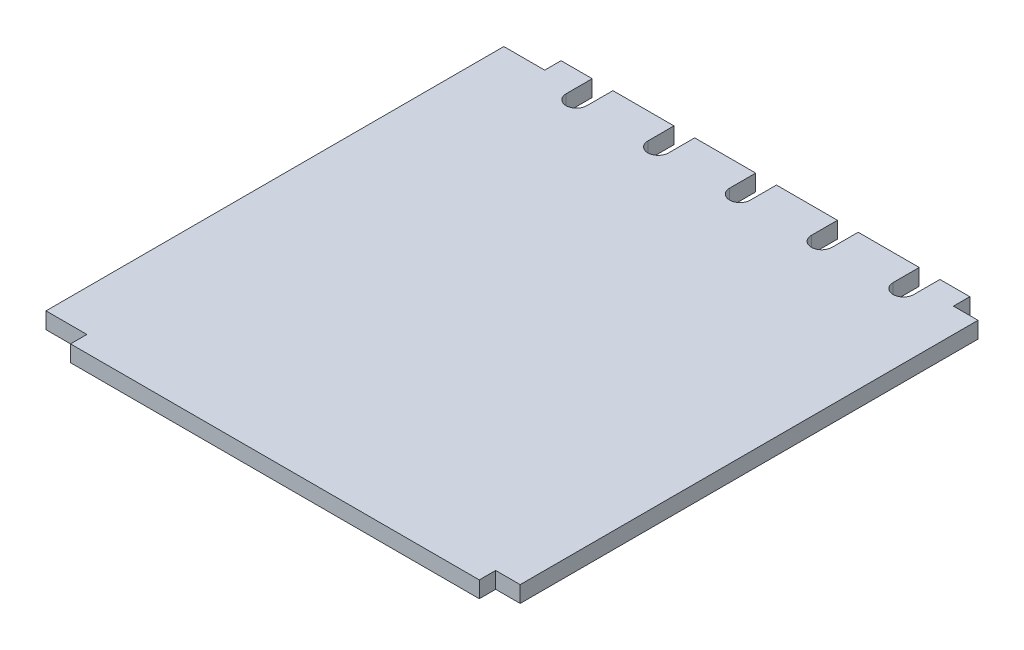
ISO-10303-21;
HEADER;
FILE_DESCRIPTION(('STEP AP214'),'2;1');
FILE_NAME('part.step','',(''),(''),'','','');
FILE_SCHEMA(('AUTOMOTIVE_DESIGN { 1 0 10303 214 1 1 1 1 }'));
ENDSEC;
DATA;
#1=APPLICATION_CONTEXT('core data for automotive mechanical design processes');
#2=APPLICATION_PROTOCOL_DEFINITION('international standard','automotive_design',2000,#1);
#3=PRODUCT_CONTEXT('',#1,'mechanical');
#4=PRODUCT('Part','Part','',(#3));
#5=PRODUCT_RELATED_PRODUCT_CATEGORY('part','',(#4));
#6=PRODUCT_DEFINITION_FORMATION('','',#4);
#7=PRODUCT_DEFINITION_CONTEXT('part definition',#1,'design');
#8=PRODUCT_DEFINITION('design','',#6,#7);
#9=PRODUCT_DEFINITION_SHAPE('','',#8);
#10=(LENGTH_UNIT() NAMED_UNIT(*) SI_UNIT(.MILLI.,.METRE.));
#11=(NAMED_UNIT(*) PLANE_ANGLE_UNIT() SI_UNIT($,.RADIAN.));
#12=(NAMED_UNIT(*) SI_UNIT($,.STERADIAN.) SOLID_ANGLE_UNIT());
#13=UNCERTAINTY_MEASURE_WITH_UNIT(LENGTH_MEASURE(1.E-05),#10,'distance_accuracy_value','');
#14=(GEOMETRIC_REPRESENTATION_CONTEXT(3) GLOBAL_UNCERTAINTY_ASSIGNED_CONTEXT((#13)) GLOBAL_UNIT_ASSIGNED_CONTEXT((#10,
#11,#12)) REPRESENTATION_CONTEXT('',''));
#15=CARTESIAN_POINT('',(0.,0.,0.));
#16=DIRECTION('',(0.,0.,1.));
#17=DIRECTION('',(1.,0.,0.));
#18=AXIS2_PLACEMENT_3D('',#15,#16,#17);
#19=CARTESIAN_POINT('',(-76.2,5.08,63.5));
#20=DIRECTION('',(1.,0.,0.));
#21=DIRECTION('',(0.,0.,-1.));
#22=AXIS2_PLACEMENT_3D('',#19,#20,#21);
#23=PLANE('',#22);
#24=DIRECTION('',(0.,0.,1.));
#25=VECTOR('',#24,1.);
#26=CARTESIAN_POINT('',(-76.2,0.,63.5));
#27=LINE('',#26,#25);
#28=CARTESIAN_POINT('',(-76.2,0.,-71.12));
#29=VERTEX_POINT('',#28);
#30=CARTESIAN_POINT('',(-76.2,0.,71.12));
#31=VERTEX_POINT('',#30);
#32=EDGE_CURVE('E277',#29,#31,#27,.T.);
#33=ORIENTED_EDGE('',*,*,#32,.T.);
#34=DIRECTION('',(0.,-1.,0.));
#35=VECTOR('',#34,1.);
#36=CARTESIAN_POINT('',(-76.2,5.08,71.12));
#37=LINE('',#36,#35);
#38=CARTESIAN_POINT('',(-76.2,5.08,71.12));
#39=VERTEX_POINT('',#38);
#40=EDGE_CURVE('E41',#39,#31,#37,.T.);
#41=ORIENTED_EDGE('',*,*,#40,.F.);
#42=DIRECTION('',(0.,0.,1.));
#43=VECTOR('',#42,1.);
#44=CARTESIAN_POINT('',(-76.2,5.08,-63.5));
#45=LINE('',#44,#43);
#46=CARTESIAN_POINT('',(-76.2,5.08,-71.12));
#47=VERTEX_POINT('',#46);
#48=EDGE_CURVE('E165',#47,#39,#45,.T.);
#49=ORIENTED_EDGE('',*,*,#48,.F.);
#50=DIRECTION('',(0.,-1.,0.));
#51=VECTOR('',#50,1.);
#52=CARTESIAN_POINT('',(-76.2,5.08,-71.12));
#53=LINE('',#52,#51);
#54=EDGE_CURVE('E11',#47,#29,#53,.T.);
#55=ORIENTED_EDGE('',*,*,#54,.T.);
#56=EDGE_LOOP('',(#33,#41,#49,#55));
#57=FACE_BOUND('',#56,.T.);
#58=ADVANCED_FACE('F33',(#57),#23,.F.);
#59=CARTESIAN_POINT('',(-71.12,5.08,71.12));
#60=DIRECTION('',(0.,0.,-1.));
#61=DIRECTION('',(-1.,0.,0.));
#62=AXIS2_PLACEMENT_3D('',#59,#60,#61);
#63=PLANE('',#62);
#64=DIRECTION('',(1.,0.,0.));
#65=VECTOR('',#64,1.);
#66=CARTESIAN_POINT('',(-71.12,0.,71.12));
#67=LINE('',#66,#65);
#68=CARTESIAN_POINT('',(-63.4999999999999,0.,71.12));
#69=VERTEX_POINT('',#68);
#70=EDGE_CURVE('E280',#31,#69,#67,.T.);
#71=ORIENTED_EDGE('',*,*,#70,.T.);
#72=DIRECTION('',(0.,-1.,0.));
#73=VECTOR('',#72,1.);
#74=CARTESIAN_POINT('',(-63.4999999999999,5.08,71.12));
#75=LINE('',#74,#73);
#76=CARTESIAN_POINT('',(-63.4999999999999,5.08,71.12));
#77=VERTEX_POINT('',#76);
#78=EDGE_CURVE('E419',#77,#69,#75,.T.);
#79=ORIENTED_EDGE('',*,*,#78,.F.);
#80=DIRECTION('',(1.,0.,0.));
#81=VECTOR('',#80,1.);
#82=CARTESIAN_POINT('',(-76.2,5.08,71.12));
#83=LINE('',#82,#81);
#84=EDGE_CURVE('E426',#39,#77,#83,.T.);
#85=ORIENTED_EDGE('',*,*,#84,.F.);
#86=ORIENTED_EDGE('',*,*,#40,.T.);
#87=EDGE_LOOP('',(#71,#79,#85,#86));
#88=FACE_BOUND('',#87,.T.);
#89=ADVANCED_FACE('F424',(#88),#63,.F.);
#90=CARTESIAN_POINT('',(-63.4999999999999,5.08,76.2));
#91=DIRECTION('',(1.,0.,0.));
#92=DIRECTION('',(0.,0.,-1.));
#93=AXIS2_PLACEMENT_3D('',#90,#91,#92);
#94=PLANE('',#93);
#95=DIRECTION('',(0.,0.,1.));
#96=VECTOR('',#95,1.);
#97=CARTESIAN_POINT('',(-63.4999999999999,0.,76.2));
#98=LINE('',#97,#96);
#99=CARTESIAN_POINT('',(-63.4999999999999,0.,76.2));
#100=VERTEX_POINT('',#99);
#101=EDGE_CURVE('E282',#69,#100,#98,.T.);
#102=ORIENTED_EDGE('',*,*,#101,.T.);
#103=DIRECTION('',(0.,-1.,0.));
#104=VECTOR('',#103,1.);
#105=CARTESIAN_POINT('',(-63.4999999999999,5.08,76.2));
#106=LINE('',#105,#104);
#107=CARTESIAN_POINT('',(-63.4999999999999,5.08,76.2));
#108=VERTEX_POINT('',#107);
#109=EDGE_CURVE('E416',#108,#100,#106,.T.);
#110=ORIENTED_EDGE('',*,*,#109,.F.);
#111=DIRECTION('',(0.,0.,1.));
#112=VECTOR('',#111,1.);
#113=CARTESIAN_POINT('',(-63.4999999999999,5.08,76.2));
#114=LINE('',#113,#112);
#115=EDGE_CURVE('E437',#77,#108,#114,.T.);
#116=ORIENTED_EDGE('',*,*,#115,.F.);
#117=ORIENTED_EDGE('',*,*,#78,.T.);
#118=EDGE_LOOP('',(#102,#110,#116,#117));
#119=FACE_BOUND('',#118,.T.);
#120=ADVANCED_FACE('F611',(#119),#94,.F.);
#121=CARTESIAN_POINT('',(-63.4999999999999,5.08,76.2));
#122=DIRECTION('',(0.,0.,-1.));
#123=DIRECTION('',(-1.,0.,0.));
#124=AXIS2_PLACEMENT_3D('',#121,#122,#123);
#125=PLANE('',#124);
#126=DIRECTION('',(1.,0.,0.));
#127=VECTOR('',#126,1.);
#128=CARTESIAN_POINT('',(-63.4999999999999,0.,76.2));
#129=LINE('',#128,#127);
#130=CARTESIAN_POINT('',(63.5,0.,76.2));
#131=VERTEX_POINT('',#130);
#132=EDGE_CURVE('E284',#100,#131,#129,.T.);
#133=ORIENTED_EDGE('',*,*,#132,.T.);
#134=DIRECTION('',(0.,-1.,0.));
#135=VECTOR('',#134,1.);
#136=CARTESIAN_POINT('',(63.5,5.08,76.2));
#137=LINE('',#136,#135);
#138=CARTESIAN_POINT('',(63.5,5.08,76.2));
#139=VERTEX_POINT('',#138);
#140=EDGE_CURVE('E413',#139,#131,#137,.T.);
#141=ORIENTED_EDGE('',*,*,#140,.F.);
#142=DIRECTION('',(1.,0.,0.));
#143=VECTOR('',#142,1.);
#144=CARTESIAN_POINT('',(-63.4999999999999,5.08,76.2));
#145=LINE('',#144,#143);
#146=EDGE_CURVE('E439',#108,#139,#145,.T.);
#147=ORIENTED_EDGE('',*,*,#146,.F.);
#148=ORIENTED_EDGE('',*,*,#109,.T.);
#149=EDGE_LOOP('',(#133,#141,#147,#148));
#150=FACE_BOUND('',#149,.T.);
#151=ADVANCED_FACE('F607',(#150),#125,.F.);
#152=CARTESIAN_POINT('',(63.5,5.08,76.2));
#153=DIRECTION('',(-1.,0.,0.));
#154=DIRECTION('',(0.,0.,1.));
#155=AXIS2_PLACEMENT_3D('',#152,#153,#154);
#156=PLANE('',#155);
#157=DIRECTION('',(0.,0.,-1.));
#158=VECTOR('',#157,1.);
#159=CARTESIAN_POINT('',(63.5,0.,76.2));
#160=LINE('',#159,#158);
#161=CARTESIAN_POINT('',(63.5,0.,71.12));
#162=VERTEX_POINT('',#161);
#163=EDGE_CURVE('E286',#131,#162,#160,.T.);
#164=ORIENTED_EDGE('',*,*,#163,.T.);
#165=DIRECTION('',(0.,-1.,0.));
#166=VECTOR('',#165,1.);
#167=CARTESIAN_POINT('',(63.5,5.08,71.12));
#168=LINE('',#167,#166);
#169=CARTESIAN_POINT('',(63.5,5.08,71.12));
#170=VERTEX_POINT('',#169);
#171=EDGE_CURVE('E410',#170,#162,#168,.T.);
#172=ORIENTED_EDGE('',*,*,#171,.F.);
#173=DIRECTION('',(0.,0.,-1.));
#174=VECTOR('',#173,1.);
#175=CARTESIAN_POINT('',(63.5,5.08,76.2));
#176=LINE('',#175,#174);
#177=EDGE_CURVE('E441',#139,#170,#176,.T.);
#178=ORIENTED_EDGE('',*,*,#177,.F.);
#179=ORIENTED_EDGE('',*,*,#140,.T.);
#180=EDGE_LOOP('',(#164,#172,#178,#179));
#181=FACE_BOUND('',#180,.T.);
#182=ADVANCED_FACE('F602',(#181),#156,.F.);
#183=CARTESIAN_POINT('',(63.5,5.08,71.12));
#184=DIRECTION('',(0.,0.,-1.));
#185=DIRECTION('',(-1.,0.,0.));
#186=AXIS2_PLACEMENT_3D('',#183,#184,#185);
#187=PLANE('',#186);
#188=DIRECTION('',(1.,0.,0.));
#189=VECTOR('',#188,1.);
#190=CARTESIAN_POINT('',(63.5,0.,71.12));
#191=LINE('',#190,#189);
#192=CARTESIAN_POINT('',(71.12,0.,71.12));
#193=VERTEX_POINT('',#192);
#194=EDGE_CURVE('E288',#162,#193,#191,.T.);
#195=ORIENTED_EDGE('',*,*,#194,.T.);
#196=DIRECTION('',(0.,-1.,0.));
#197=VECTOR('',#196,1.);
#198=CARTESIAN_POINT('',(71.12,5.08,71.12));
#199=LINE('',#198,#197);
#200=CARTESIAN_POINT('',(71.12,5.08,71.12));
#201=VERTEX_POINT('',#200);
#202=EDGE_CURVE('E407',#201,#193,#199,.T.);
#203=ORIENTED_EDGE('',*,*,#202,.F.);
#204=DIRECTION('',(1.,0.,0.));
#205=VECTOR('',#204,1.);
#206=CARTESIAN_POINT('',(63.5,5.08,71.12));
#207=LINE('',#206,#205);
#208=EDGE_CURVE('E443',#170,#201,#207,.T.);
#209=ORIENTED_EDGE('',*,*,#208,.F.);
#210=ORIENTED_EDGE('',*,*,#171,.T.);
#211=EDGE_LOOP('',(#195,#203,#209,#210));
#212=FACE_BOUND('',#211,.T.);
#213=ADVANCED_FACE('F597',(#212),#187,.F.);
#214=CARTESIAN_POINT('',(71.12,5.08,-63.5));
#215=DIRECTION('',(-1.,0.,0.));
#216=DIRECTION('',(0.,0.,1.));
#217=AXIS2_PLACEMENT_3D('',#214,#215,#216);
#218=PLANE('',#217);
#219=DIRECTION('',(0.,0.,-1.));
#220=VECTOR('',#219,1.);
#221=CARTESIAN_POINT('',(71.12,0.,-63.5));
#222=LINE('',#221,#220);
#223=CARTESIAN_POINT('',(71.12,0.,-71.12));
#224=VERTEX_POINT('',#223);
#225=EDGE_CURVE('E291',#193,#224,#222,.T.);
#226=ORIENTED_EDGE('',*,*,#225,.T.);
#227=DIRECTION('',(0.,-1.,0.));
#228=VECTOR('',#227,1.);
#229=CARTESIAN_POINT('',(71.12,5.08,-71.12));
#230=LINE('',#229,#228);
#231=CARTESIAN_POINT('',(71.12,5.08,-71.12));
#232=VERTEX_POINT('',#231);
#233=EDGE_CURVE('E404',#232,#224,#230,.T.);
#234=ORIENTED_EDGE('',*,*,#233,.F.);
#235=DIRECTION('',(0.,0.,-1.));
#236=VECTOR('',#235,1.);
#237=CARTESIAN_POINT('',(71.12,5.08,71.12));
#238=LINE('',#237,#236);
#239=EDGE_CURVE('E445',#201,#232,#238,.T.);
#240=ORIENTED_EDGE('',*,*,#239,.F.);
#241=ORIENTED_EDGE('',*,*,#202,.T.);
#242=EDGE_LOOP('',(#226,#234,#240,#241));
#243=FACE_BOUND('',#242,.T.);
#244=ADVANCED_FACE('F593',(#243),#218,.F.);
#245=CARTESIAN_POINT('',(63.5,5.08,-71.12));
#246=DIRECTION('',(0.,0.,1.));
#247=DIRECTION('',(1.,0.,0.));
#248=AXIS2_PLACEMENT_3D('',#245,#246,#247);
#249=PLANE('',#248);
#250=DIRECTION('',(-1.,0.,0.));
#251=VECTOR('',#250,1.);
#252=CARTESIAN_POINT('',(63.5,0.,-71.12));
#253=LINE('',#252,#251);
#254=CARTESIAN_POINT('',(63.5,0.,-71.12));
#255=VERTEX_POINT('',#254);
#256=EDGE_CURVE('E293',#224,#255,#253,.T.);
#257=ORIENTED_EDGE('',*,*,#256,.T.);
#258=DIRECTION('',(0.,-1.,0.));
#259=VECTOR('',#258,1.);
#260=CARTESIAN_POINT('',(63.5,5.08,-71.12));
#261=LINE('',#260,#259);
#262=CARTESIAN_POINT('',(63.5,5.08,-71.12));
#263=VERTEX_POINT('',#262);
#264=EDGE_CURVE('E401',#263,#255,#261,.T.);
#265=ORIENTED_EDGE('',*,*,#264,.F.);
#266=DIRECTION('',(-1.,0.,0.));
#267=VECTOR('',#266,1.);
#268=CARTESIAN_POINT('',(63.5,5.08,-71.12));
#269=LINE('',#268,#267);
#270=EDGE_CURVE('E447',#232,#263,#269,.T.);
#271=ORIENTED_EDGE('',*,*,#270,.F.);
#272=ORIENTED_EDGE('',*,*,#233,.T.);
#273=EDGE_LOOP('',(#257,#265,#271,#272));
#274=FACE_BOUND('',#273,.T.);
#275=ADVANCED_FACE('F588',(#274),#249,.F.);
#276=CARTESIAN_POINT('',(63.5,5.08,-76.2));
#277=DIRECTION('',(-1.,0.,0.));
#278=DIRECTION('',(0.,0.,1.));
#279=AXIS2_PLACEMENT_3D('',#276,#277,#278);
#280=PLANE('',#279);
#281=DIRECTION('',(0.,0.,-1.));
#282=VECTOR('',#281,1.);
#283=CARTESIAN_POINT('',(63.5,0.,-76.2));
#284=LINE('',#283,#282);
#285=CARTESIAN_POINT('',(63.5,0.,-76.2));
#286=VERTEX_POINT('',#285);
#287=EDGE_CURVE('E295',#255,#286,#284,.T.);
#288=ORIENTED_EDGE('',*,*,#287,.T.);
#289=DIRECTION('',(0.,-1.,0.));
#290=VECTOR('',#289,1.);
#291=CARTESIAN_POINT('',(63.5,5.08,-76.2));
#292=LINE('',#291,#290);
#293=CARTESIAN_POINT('',(63.5,5.08,-76.2));
#294=VERTEX_POINT('',#293);
#295=EDGE_CURVE('E398',#294,#286,#292,.T.);
#296=ORIENTED_EDGE('',*,*,#295,.F.);
#297=DIRECTION('',(0.,0.,-1.));
#298=VECTOR('',#297,1.);
#299=CARTESIAN_POINT('',(63.5,5.08,-76.2));
#300=LINE('',#299,#298);
#301=EDGE_CURVE('E449',#263,#294,#300,.T.);
#302=ORIENTED_EDGE('',*,*,#301,.F.);
#303=ORIENTED_EDGE('',*,*,#264,.T.);
#304=EDGE_LOOP('',(#288,#296,#302,#303));
#305=FACE_BOUND('',#304,.T.);
#306=ADVANCED_FACE('F583',(#305),#280,.F.);
#307=CARTESIAN_POINT('',(54.2176697496567,5.08,-76.2));
#308=DIRECTION('',(0.,0.,1.));
#309=DIRECTION('',(1.,0.,0.));
#310=AXIS2_PLACEMENT_3D('',#307,#308,#309);
#311=PLANE('',#310);
#312=DIRECTION('',(-1.,0.,0.));
#313=VECTOR('',#312,1.);
#314=CARTESIAN_POINT('',(54.2176697496567,0.,-76.2));
#315=LINE('',#314,#313);
#316=CARTESIAN_POINT('',(54.2176697496567,0.,-76.2));
#317=VERTEX_POINT('',#316);
#318=EDGE_CURVE('E297',#286,#317,#315,.T.);
#319=ORIENTED_EDGE('',*,*,#318,.T.);
#320=DIRECTION('',(0.,-1.,0.));
#321=VECTOR('',#320,1.);
#322=CARTESIAN_POINT('',(54.2176697496567,5.08,-76.2));
#323=LINE('',#322,#321);
#324=CARTESIAN_POINT('',(54.2176697496567,5.08,-76.2));
#325=VERTEX_POINT('',#324);
#326=EDGE_CURVE('E395',#325,#317,#323,.T.);
#327=ORIENTED_EDGE('',*,*,#326,.F.);
#328=DIRECTION('',(-1.,0.,0.));
#329=VECTOR('',#328,1.);
#330=CARTESIAN_POINT('',(54.2176697496567,5.08,-76.2));
#331=LINE('',#330,#329);
#332=EDGE_CURVE('E451',#294,#325,#331,.T.);
#333=ORIENTED_EDGE('',*,*,#332,.F.);
#334=ORIENTED_EDGE('',*,*,#295,.T.);
#335=EDGE_LOOP('',(#319,#327,#333,#334));
#336=FACE_BOUND('',#335,.T.);
#337=ADVANCED_FACE('F579',(#336),#311,.F.);
#338=CARTESIAN_POINT('',(54.2176697496567,5.08,-76.2));
#339=DIRECTION('',(1.,0.,0.));
#340=DIRECTION('',(0.,0.,-1.));
#341=AXIS2_PLACEMENT_3D('',#338,#339,#340);
#342=PLANE('',#341);
#343=DIRECTION('',(0.,0.,1.));
#344=VECTOR('',#343,1.);
#345=CARTESIAN_POINT('',(54.2176697496567,0.,-76.2));
#346=LINE('',#345,#344);
#347=CARTESIAN_POINT('',(54.2176697496567,0.,-68.0904552145307));
#348=VERTEX_POINT('',#347);
#349=EDGE_CURVE('E299',#317,#348,#346,.T.);
#350=ORIENTED_EDGE('',*,*,#349,.T.);
#351=DIRECTION('',(0.,-1.,0.));
#352=VECTOR('',#351,1.);
#353=CARTESIAN_POINT('',(54.2176697496567,5.08,-68.0904552145307));
#354=LINE('',#353,#352);
#355=CARTESIAN_POINT('',(54.2176697496567,5.08,-68.0904552145307));
#356=VERTEX_POINT('',#355);
#357=EDGE_CURVE('E392',#356,#348,#354,.T.);
#358=ORIENTED_EDGE('',*,*,#357,.F.);
#359=DIRECTION('',(0.,0.,1.));
#360=VECTOR('',#359,1.);
#361=CARTESIAN_POINT('',(54.2176697496567,5.08,-76.2));
#362=LINE('',#361,#360);
#363=EDGE_CURVE('E453',#325,#356,#362,.T.);
#364=ORIENTED_EDGE('',*,*,#363,.F.);
#365=ORIENTED_EDGE('',*,*,#326,.T.);
#366=EDGE_LOOP('',(#350,#358,#364,#365));
#367=FACE_BOUND('',#366,.T.);
#368=ADVANCED_FACE('F574',(#367),#342,.F.);
#369=CARTESIAN_POINT('',(50.9978526779401,5.08,-68.0904552145307));
#370=DIRECTION('',(0.,-1.,0.));
#371=DIRECTION('',(0.,0.,-1.));
#372=AXIS2_PLACEMENT_3D('',#369,#370,#371);
#373=CYLINDRICAL_SURFACE('',#372,3.21981707171659);
#374=CARTESIAN_POINT('',(50.9978526779401,0.,-68.0904552145307));
#375=DIRECTION('',(0.,-1.,0.));
#376=DIRECTION('',(0.,0.,1.));
#377=AXIS2_PLACEMENT_3D('',#374,#375,#376);
#378=CIRCLE('',#377,3.21981707171659);
#379=CARTESIAN_POINT('',(47.7780356062235,0.,-68.0904552145307));
#380=VERTEX_POINT('',#379);
#381=EDGE_CURVE('E301',#348,#380,#378,.T.);
#382=ORIENTED_EDGE('',*,*,#381,.T.);
#383=DIRECTION('',(0.,-1.,0.));
#384=VECTOR('',#383,1.);
#385=CARTESIAN_POINT('',(47.7780356062235,5.08,-68.0904552145307));
#386=LINE('',#385,#384);
#387=CARTESIAN_POINT('',(47.7780356062235,5.08,-68.0904552145307));
#388=VERTEX_POINT('',#387);
#389=EDGE_CURVE('E389',#388,#380,#386,.T.);
#390=ORIENTED_EDGE('',*,*,#389,.F.);
#391=CARTESIAN_POINT('',(50.9978526779401,5.08,-68.0904552145307));
#392=DIRECTION('',(0.,-1.,0.));
#393=DIRECTION('',(0.,0.,1.));
#394=AXIS2_PLACEMENT_3D('',#391,#392,#393);
#395=CIRCLE('',#394,3.21981707171659);
#396=EDGE_CURVE('E455',#356,#388,#395,.T.);
#397=ORIENTED_EDGE('',*,*,#396,.F.);
#398=ORIENTED_EDGE('',*,*,#357,.T.);
#399=EDGE_LOOP('',(#382,#390,#397,#398));
#400=FACE_BOUND('',#399,.T.);
#401=ADVANCED_FACE('F568',(#400),#373,.F.);
#402=CARTESIAN_POINT('',(47.7780356062235,5.08,-76.2));
#403=DIRECTION('',(-1.,0.,0.));
#404=DIRECTION('',(0.,0.,1.));
#405=AXIS2_PLACEMENT_3D('',#402,#403,#404);
#406=PLANE('',#405);
#407=DIRECTION('',(0.,0.,-1.));
#408=VECTOR('',#407,1.);
#409=CARTESIAN_POINT('',(47.7780356062235,0.,-76.2));
#410=LINE('',#409,#408);
#411=CARTESIAN_POINT('',(47.7780356062235,0.,-76.2));
#412=VERTEX_POINT('',#411);
#413=EDGE_CURVE('E303',#380,#412,#410,.T.);
#414=ORIENTED_EDGE('',*,*,#413,.T.);
#415=DIRECTION('',(0.,-1.,0.));
#416=VECTOR('',#415,1.);
#417=CARTESIAN_POINT('',(47.7780356062235,5.08,-76.2));
#418=LINE('',#417,#416);
#419=CARTESIAN_POINT('',(47.7780356062235,5.08,-76.2));
#420=VERTEX_POINT('',#419);
#421=EDGE_CURVE('E386',#420,#412,#418,.T.);
#422=ORIENTED_EDGE('',*,*,#421,.F.);
#423=DIRECTION('',(0.,0.,-1.));
#424=VECTOR('',#423,1.);
#425=CARTESIAN_POINT('',(47.7780356062235,5.08,-76.2));
#426=LINE('',#425,#424);
#427=EDGE_CURVE('E457',#388,#420,#426,.T.);
#428=ORIENTED_EDGE('',*,*,#427,.F.);
#429=ORIENTED_EDGE('',*,*,#389,.T.);
#430=EDGE_LOOP('',(#414,#422,#428,#429));
#431=FACE_BOUND('',#430,.T.);
#432=ADVANCED_FACE('F564',(#431),#406,.F.);
#433=CARTESIAN_POINT('',(28.8176697496567,5.08,-76.2));
#434=DIRECTION('',(0.,0.,1.));
#435=DIRECTION('',(1.,0.,0.));
#436=AXIS2_PLACEMENT_3D('',#433,#434,#435);
#437=PLANE('',#436);
#438=DIRECTION('',(-1.,0.,0.));
#439=VECTOR('',#438,1.);
#440=CARTESIAN_POINT('',(28.8176697496567,0.,-76.2));
#441=LINE('',#440,#439);
#442=CARTESIAN_POINT('',(28.8176697496567,0.,-76.2));
#443=VERTEX_POINT('',#442);
#444=EDGE_CURVE('E305',#412,#443,#441,.T.);
#445=ORIENTED_EDGE('',*,*,#444,.T.);
#446=DIRECTION('',(0.,-1.,0.));
#447=VECTOR('',#446,1.);
#448=CARTESIAN_POINT('',(28.8176697496567,5.08,-76.2));
#449=LINE('',#448,#447);
#450=CARTESIAN_POINT('',(28.8176697496567,5.08,-76.2));
#451=VERTEX_POINT('',#450);
#452=EDGE_CURVE('E383',#451,#443,#449,.T.);
#453=ORIENTED_EDGE('',*,*,#452,.F.);
#454=DIRECTION('',(-1.,0.,0.));
#455=VECTOR('',#454,1.);
#456=CARTESIAN_POINT('',(28.8176697496567,5.08,-76.2));
#457=LINE('',#456,#455);
#458=EDGE_CURVE('E459',#420,#451,#457,.T.);
#459=ORIENTED_EDGE('',*,*,#458,.F.);
#460=ORIENTED_EDGE('',*,*,#421,.T.);
#461=EDGE_LOOP('',(#445,#453,#459,#460));
#462=FACE_BOUND('',#461,.T.);
#463=ADVANCED_FACE('F559',(#462),#437,.F.);
#464=CARTESIAN_POINT('',(28.8176697496567,5.08,-76.2));
#465=DIRECTION('',(1.,0.,0.));
#466=DIRECTION('',(0.,0.,-1.));
#467=AXIS2_PLACEMENT_3D('',#464,#465,#466);
#468=PLANE('',#467);
#469=DIRECTION('',(0.,0.,1.));
#470=VECTOR('',#469,1.);
#471=CARTESIAN_POINT('',(28.8176697496567,0.,-76.2));
#472=LINE('',#471,#470);
#473=CARTESIAN_POINT('',(28.8176697496567,0.,-68.0904552145307));
#474=VERTEX_POINT('',#473);
#475=EDGE_CURVE('E307',#443,#474,#472,.T.);
#476=ORIENTED_EDGE('',*,*,#475,.T.);
#477=DIRECTION('',(0.,-1.,0.));
#478=VECTOR('',#477,1.);
#479=CARTESIAN_POINT('',(28.8176697496567,5.08,-68.0904552145307));
#480=LINE('',#479,#478);
#481=CARTESIAN_POINT('',(28.8176697496567,5.08,-68.0904552145307));
#482=VERTEX_POINT('',#481);
#483=EDGE_CURVE('E380',#482,#474,#480,.T.);
#484=ORIENTED_EDGE('',*,*,#483,.F.);
#485=DIRECTION('',(0.,0.,1.));
#486=VECTOR('',#485,1.);
#487=CARTESIAN_POINT('',(28.8176697496567,5.08,-76.2));
#488=LINE('',#487,#486);
#489=EDGE_CURVE('E461',#451,#482,#488,.T.);
#490=ORIENTED_EDGE('',*,*,#489,.F.);
#491=ORIENTED_EDGE('',*,*,#452,.T.);
#492=EDGE_LOOP('',(#476,#484,#490,#491));
#493=FACE_BOUND('',#492,.T.);
#494=ADVANCED_FACE('F553',(#493),#468,.F.);
#495=CARTESIAN_POINT('',(25.5978526779401,5.08,-68.0904552145307));
#496=DIRECTION('',(0.,-1.,0.));
#497=DIRECTION('',(0.,0.,-1.));
#498=AXIS2_PLACEMENT_3D('',#495,#496,#497);
#499=CYLINDRICAL_SURFACE('',#498,3.21981707171659);
#500=CARTESIAN_POINT('',(25.5978526779401,0.,-68.0904552145307));
#501=DIRECTION('',(0.,-1.,0.));
#502=DIRECTION('',(0.,0.,1.));
#503=AXIS2_PLACEMENT_3D('',#500,#501,#502);
#504=CIRCLE('',#503,3.21981707171659);
#505=CARTESIAN_POINT('',(22.3780356062235,0.,-68.0904552145307));
#506=VERTEX_POINT('',#505);
#507=EDGE_CURVE('E309',#474,#506,#504,.T.);
#508=ORIENTED_EDGE('',*,*,#507,.T.);
#509=DIRECTION('',(0.,-1.,0.));
#510=VECTOR('',#509,1.);
#511=CARTESIAN_POINT('',(22.3780356062235,5.08,-68.0904552145307));
#512=LINE('',#511,#510);
#513=CARTESIAN_POINT('',(22.3780356062235,5.08,-68.0904552145307));
#514=VERTEX_POINT('',#513);
#515=EDGE_CURVE('E377',#514,#506,#512,.T.);
#516=ORIENTED_EDGE('',*,*,#515,.F.);
#517=CARTESIAN_POINT('',(25.5978526779401,5.08,-68.0904552145307));
#518=DIRECTION('',(0.,-1.,0.));
#519=DIRECTION('',(0.,0.,1.));
#520=AXIS2_PLACEMENT_3D('',#517,#518,#519);
#521=CIRCLE('',#520,3.21981707171659);
#522=EDGE_CURVE('E463',#482,#514,#521,.T.);
#523=ORIENTED_EDGE('',*,*,#522,.F.);
#524=ORIENTED_EDGE('',*,*,#483,.T.);
#525=EDGE_LOOP('',(#508,#516,#523,#524));
#526=FACE_BOUND('',#525,.T.);
#527=ADVANCED_FACE('F549',(#526),#499,.F.);
#528=CARTESIAN_POINT('',(22.3780356062235,5.08,-76.2));
#529=DIRECTION('',(-1.,0.,0.));
#530=DIRECTION('',(0.,0.,1.));
#531=AXIS2_PLACEMENT_3D('',#528,#529,#530);
#532=PLANE('',#531);
#533=DIRECTION('',(0.,0.,-1.));
#534=VECTOR('',#533,1.);
#535=CARTESIAN_POINT('',(22.3780356062235,0.,-76.2));
#536=LINE('',#535,#534);
#537=CARTESIAN_POINT('',(22.3780356062235,0.,-76.2));
#538=VERTEX_POINT('',#537);
#539=EDGE_CURVE('E311',#506,#538,#536,.T.);
#540=ORIENTED_EDGE('',*,*,#539,.T.);
#541=DIRECTION('',(0.,-1.,0.));
#542=VECTOR('',#541,1.);
#543=CARTESIAN_POINT('',(22.3780356062235,5.08,-76.2));
#544=LINE('',#543,#542);
#545=CARTESIAN_POINT('',(22.3780356062235,5.08,-76.2));
#546=VERTEX_POINT('',#545);
#547=EDGE_CURVE('E374',#546,#538,#544,.T.);
#548=ORIENTED_EDGE('',*,*,#547,.F.);
#549=DIRECTION('',(0.,0.,-1.));
#550=VECTOR('',#549,1.);
#551=CARTESIAN_POINT('',(22.3780356062235,5.08,-76.2));
#552=LINE('',#551,#550);
#553=EDGE_CURVE('E465',#514,#546,#552,.T.);
#554=ORIENTED_EDGE('',*,*,#553,.F.);
#555=ORIENTED_EDGE('',*,*,#515,.T.);
#556=EDGE_LOOP('',(#540,#548,#554,#555));
#557=FACE_BOUND('',#556,.T.);
#558=ADVANCED_FACE('F544',(#557),#532,.F.);
#559=CARTESIAN_POINT('',(3.41766974965667,5.08,-76.2));
#560=DIRECTION('',(0.,0.,1.));
#561=DIRECTION('',(1.,0.,0.));
#562=AXIS2_PLACEMENT_3D('',#559,#560,#561);
#563=PLANE('',#562);
#564=DIRECTION('',(-1.,0.,0.));
#565=VECTOR('',#564,1.);
#566=CARTESIAN_POINT('',(3.41766974965667,0.,-76.2));
#567=LINE('',#566,#565);
#568=CARTESIAN_POINT('',(3.41766974965667,0.,-76.2));
#569=VERTEX_POINT('',#568);
#570=EDGE_CURVE('E313',#538,#569,#567,.T.);
#571=ORIENTED_EDGE('',*,*,#570,.T.);
#572=DIRECTION('',(0.,-1.,0.));
#573=VECTOR('',#572,1.);
#574=CARTESIAN_POINT('',(3.41766974965667,5.08,-76.2));
#575=LINE('',#574,#573);
#576=CARTESIAN_POINT('',(3.41766974965667,5.08,-76.2));
#577=VERTEX_POINT('',#576);
#578=EDGE_CURVE('E371',#577,#569,#575,.T.);
#579=ORIENTED_EDGE('',*,*,#578,.F.);
#580=DIRECTION('',(-1.,0.,0.));
#581=VECTOR('',#580,1.);
#582=CARTESIAN_POINT('',(3.41766974965667,5.08,-76.2));
#583=LINE('',#582,#581);
#584=EDGE_CURVE('E467',#546,#577,#583,.T.);
#585=ORIENTED_EDGE('',*,*,#584,.F.);
#586=ORIENTED_EDGE('',*,*,#547,.T.);
#587=EDGE_LOOP('',(#571,#579,#585,#586));
#588=FACE_BOUND('',#587,.T.);
#589=ADVANCED_FACE('F538',(#588),#563,.F.);
#590=CARTESIAN_POINT('',(3.41766974965667,5.08,-76.2));
#591=DIRECTION('',(1.,0.,0.));
#592=DIRECTION('',(0.,0.,-1.));
#593=AXIS2_PLACEMENT_3D('',#590,#591,#592);
#594=PLANE('',#593);
#595=DIRECTION('',(0.,0.,1.));
#596=VECTOR('',#595,1.);
#597=CARTESIAN_POINT('',(3.41766974965667,0.,-76.2));
#598=LINE('',#597,#596);
#599=CARTESIAN_POINT('',(3.41766974965667,0.,-68.0904552145307));
#600=VERTEX_POINT('',#599);
#601=EDGE_CURVE('E315',#569,#600,#598,.T.);
#602=ORIENTED_EDGE('',*,*,#601,.T.);
#603=DIRECTION('',(0.,-1.,0.));
#604=VECTOR('',#603,1.);
#605=CARTESIAN_POINT('',(3.41766974965667,5.08,-68.0904552145307));
#606=LINE('',#605,#604);
#607=CARTESIAN_POINT('',(3.41766974965667,5.08,-68.0904552145307));
#608=VERTEX_POINT('',#607);
#609=EDGE_CURVE('E368',#608,#600,#606,.T.);
#610=ORIENTED_EDGE('',*,*,#609,.F.);
#611=DIRECTION('',(0.,0.,1.));
#612=VECTOR('',#611,1.);
#613=CARTESIAN_POINT('',(3.41766974965667,5.08,-76.2));
#614=LINE('',#613,#612);
#615=EDGE_CURVE('E469',#577,#608,#614,.T.);
#616=ORIENTED_EDGE('',*,*,#615,.F.);
#617=ORIENTED_EDGE('',*,*,#578,.T.);
#618=EDGE_LOOP('',(#602,#610,#616,#617));
#619=FACE_BOUND('',#618,.T.);
#620=ADVANCED_FACE('F534',(#619),#594,.F.);
#621=CARTESIAN_POINT('',(0.197852677940077,5.08,-68.0904552145307));
#622=DIRECTION('',(0.,-1.,0.));
#623=DIRECTION('',(0.,0.,-1.));
#624=AXIS2_PLACEMENT_3D('',#621,#622,#623);
#625=CYLINDRICAL_SURFACE('',#624,3.21981707171659);
#626=CARTESIAN_POINT('',(0.197852677940077,0.,-68.0904552145307));
#627=DIRECTION('',(0.,-1.,0.));
#628=DIRECTION('',(0.,0.,1.));
#629=AXIS2_PLACEMENT_3D('',#626,#627,#628);
#630=CIRCLE('',#629,3.21981707171659);
#631=CARTESIAN_POINT('',(-3.02196439377651,0.,-68.0904552145307));
#632=VERTEX_POINT('',#631);
#633=EDGE_CURVE('E317',#600,#632,#630,.T.);
#634=ORIENTED_EDGE('',*,*,#633,.T.);
#635=DIRECTION('',(0.,-1.,0.));
#636=VECTOR('',#635,1.);
#637=CARTESIAN_POINT('',(-3.02196439377651,5.08,-68.0904552145307));
#638=LINE('',#637,#636);
#639=CARTESIAN_POINT('',(-3.02196439377651,5.08,-68.0904552145307));
#640=VERTEX_POINT('',#639);
#641=EDGE_CURVE('E365',#640,#632,#638,.T.);
#642=ORIENTED_EDGE('',*,*,#641,.F.);
#643=CARTESIAN_POINT('',(0.197852677940077,5.08,-68.0904552145307));
#644=DIRECTION('',(0.,-1.,0.));
#645=DIRECTION('',(0.,0.,1.));
#646=AXIS2_PLACEMENT_3D('',#643,#644,#645);
#647=CIRCLE('',#646,3.21981707171659);
#648=EDGE_CURVE('E471',#608,#640,#647,.T.);
#649=ORIENTED_EDGE('',*,*,#648,.F.);
#650=ORIENTED_EDGE('',*,*,#609,.T.);
#651=EDGE_LOOP('',(#634,#642,#649,#650));
#652=FACE_BOUND('',#651,.T.);
#653=ADVANCED_FACE('F529',(#652),#625,.F.);
#654=CARTESIAN_POINT('',(-3.02196439377651,5.08,-76.2));
#655=DIRECTION('',(-1.,0.,0.));
#656=DIRECTION('',(0.,0.,1.));
#657=AXIS2_PLACEMENT_3D('',#654,#655,#656);
#658=PLANE('',#657);
#659=DIRECTION('',(0.,0.,-1.));
#660=VECTOR('',#659,1.);
#661=CARTESIAN_POINT('',(-3.02196439377651,0.,-76.2));
#662=LINE('',#661,#660);
#663=CARTESIAN_POINT('',(-3.02196439377651,0.,-76.2));
#664=VERTEX_POINT('',#663);
#665=EDGE_CURVE('E319',#632,#664,#662,.T.);
#666=ORIENTED_EDGE('',*,*,#665,.T.);
#667=DIRECTION('',(0.,-1.,0.));
#668=VECTOR('',#667,1.);
#669=CARTESIAN_POINT('',(-3.02196439377651,5.08,-76.2));
#670=LINE('',#669,#668);
#671=CARTESIAN_POINT('',(-3.02196439377651,5.08,-76.2));
#672=VERTEX_POINT('',#671);
#673=EDGE_CURVE('E362',#672,#664,#670,.T.);
#674=ORIENTED_EDGE('',*,*,#673,.F.);
#675=DIRECTION('',(0.,0.,-1.));
#676=VECTOR('',#675,1.);
#677=CARTESIAN_POINT('',(-3.02196439377651,5.08,-76.2));
#678=LINE('',#677,#676);
#679=EDGE_CURVE('E473',#640,#672,#678,.T.);
#680=ORIENTED_EDGE('',*,*,#679,.F.);
#681=ORIENTED_EDGE('',*,*,#641,.T.);
#682=EDGE_LOOP('',(#666,#674,#680,#681));
#683=FACE_BOUND('',#682,.T.);
#684=ADVANCED_FACE('F523',(#683),#658,.F.);
#685=CARTESIAN_POINT('',(-21.9823302503433,5.08,-76.2));
#686=DIRECTION('',(0.,0.,1.));
#687=DIRECTION('',(1.,0.,0.));
#688=AXIS2_PLACEMENT_3D('',#685,#686,#687);
#689=PLANE('',#688);
#690=DIRECTION('',(-1.,0.,0.));
#691=VECTOR('',#690,1.);
#692=CARTESIAN_POINT('',(-21.9823302503433,0.,-76.2));
#693=LINE('',#692,#691);
#694=CARTESIAN_POINT('',(-21.9823302503433,0.,-76.2));
#695=VERTEX_POINT('',#694);
#696=EDGE_CURVE('E321',#664,#695,#693,.T.);
#697=ORIENTED_EDGE('',*,*,#696,.T.);
#698=DIRECTION('',(0.,-1.,0.));
#699=VECTOR('',#698,1.);
#700=CARTESIAN_POINT('',(-21.9823302503433,5.08,-76.2));
#701=LINE('',#700,#699);
#702=CARTESIAN_POINT('',(-21.9823302503433,5.08,-76.2));
#703=VERTEX_POINT('',#702);
#704=EDGE_CURVE('E359',#703,#695,#701,.T.);
#705=ORIENTED_EDGE('',*,*,#704,.F.);
#706=DIRECTION('',(-1.,0.,0.));
#707=VECTOR('',#706,1.);
#708=CARTESIAN_POINT('',(-21.9823302503433,5.08,-76.2));
#709=LINE('',#708,#707);
#710=EDGE_CURVE('E475',#672,#703,#709,.T.);
#711=ORIENTED_EDGE('',*,*,#710,.F.);
#712=ORIENTED_EDGE('',*,*,#673,.T.);
#713=EDGE_LOOP('',(#697,#705,#711,#712));
#714=FACE_BOUND('',#713,.T.);
#715=ADVANCED_FACE('F519',(#714),#689,.F.);
#716=CARTESIAN_POINT('',(-21.9823302503433,5.08,-76.2));
#717=DIRECTION('',(1.,0.,0.));
#718=DIRECTION('',(0.,0.,-1.));
#719=AXIS2_PLACEMENT_3D('',#716,#717,#718);
#720=PLANE('',#719);
#721=DIRECTION('',(0.,0.,1.));
#722=VECTOR('',#721,1.);
#723=CARTESIAN_POINT('',(-21.9823302503433,0.,-76.2));
#724=LINE('',#723,#722);
#725=CARTESIAN_POINT('',(-21.9823302503433,0.,-68.0904552145307));
#726=VERTEX_POINT('',#725);
#727=EDGE_CURVE('E323',#695,#726,#724,.T.);
#728=ORIENTED_EDGE('',*,*,#727,.T.);
#729=DIRECTION('',(0.,-1.,0.));
#730=VECTOR('',#729,1.);
#731=CARTESIAN_POINT('',(-21.9823302503433,5.08,-68.0904552145307));
#732=LINE('',#731,#730);
#733=CARTESIAN_POINT('',(-21.9823302503433,5.08,-68.0904552145307));
#734=VERTEX_POINT('',#733);
#735=EDGE_CURVE('E356',#734,#726,#732,.T.);
#736=ORIENTED_EDGE('',*,*,#735,.F.);
#737=DIRECTION('',(0.,0.,1.));
#738=VECTOR('',#737,1.);
#739=CARTESIAN_POINT('',(-21.9823302503433,5.08,-76.2));
#740=LINE('',#739,#738);
#741=EDGE_CURVE('E477',#703,#734,#740,.T.);
#742=ORIENTED_EDGE('',*,*,#741,.F.);
#743=ORIENTED_EDGE('',*,*,#704,.T.);
#744=EDGE_LOOP('',(#728,#736,#742,#743));
#745=FACE_BOUND('',#744,.T.);
#746=ADVANCED_FACE('F514',(#745),#720,.F.);
#747=CARTESIAN_POINT('',(-25.2021473220599,5.08,-68.0904552145307));
#748=DIRECTION('',(0.,-1.,0.));
#749=DIRECTION('',(0.,0.,-1.));
#750=AXIS2_PLACEMENT_3D('',#747,#748,#749);
#751=CYLINDRICAL_SURFACE('',#750,3.21981707171659);
#752=CARTESIAN_POINT('',(-25.2021473220599,0.,-68.0904552145307));
#753=DIRECTION('',(0.,-1.,0.));
#754=DIRECTION('',(0.,0.,1.));
#755=AXIS2_PLACEMENT_3D('',#752,#753,#754);
#756=CIRCLE('',#755,3.21981707171659);
#757=CARTESIAN_POINT('',(-28.4219643937765,0.,-68.0904552145307));
#758=VERTEX_POINT('',#757);
#759=EDGE_CURVE('E325',#726,#758,#756,.T.);
#760=ORIENTED_EDGE('',*,*,#759,.T.);
#761=DIRECTION('',(0.,-1.,0.));
#762=VECTOR('',#761,1.);
#763=CARTESIAN_POINT('',(-28.4219643937765,5.08,-68.0904552145307));
#764=LINE('',#763,#762);
#765=CARTESIAN_POINT('',(-28.4219643937765,5.08,-68.0904552145307));
#766=VERTEX_POINT('',#765);
#767=EDGE_CURVE('E353',#766,#758,#764,.T.);
#768=ORIENTED_EDGE('',*,*,#767,.F.);
#769=CARTESIAN_POINT('',(-25.2021473220599,5.08,-68.0904552145307));
#770=DIRECTION('',(0.,-1.,0.));
#771=DIRECTION('',(0.,0.,1.));
#772=AXIS2_PLACEMENT_3D('',#769,#770,#771);
#773=CIRCLE('',#772,3.21981707171659);
#774=EDGE_CURVE('E479',#734,#766,#773,.T.);
#775=ORIENTED_EDGE('',*,*,#774,.F.);
#776=ORIENTED_EDGE('',*,*,#735,.T.);
#777=EDGE_LOOP('',(#760,#768,#775,#776));
#778=FACE_BOUND('',#777,.T.);
#779=ADVANCED_FACE('F508',(#778),#751,.F.);
#780=CARTESIAN_POINT('',(-28.4219643937765,5.08,-76.2));
#781=DIRECTION('',(-1.,0.,0.));
#782=DIRECTION('',(0.,0.,1.));
#783=AXIS2_PLACEMENT_3D('',#780,#781,#782);
#784=PLANE('',#783);
#785=DIRECTION('',(0.,0.,-1.));
#786=VECTOR('',#785,1.);
#787=CARTESIAN_POINT('',(-28.4219643937765,0.,-76.2));
#788=LINE('',#787,#786);
#789=CARTESIAN_POINT('',(-28.4219643937765,0.,-76.2));
#790=VERTEX_POINT('',#789);
#791=EDGE_CURVE('E327',#758,#790,#788,.T.);
#792=ORIENTED_EDGE('',*,*,#791,.T.);
#793=DIRECTION('',(0.,-1.,0.));
#794=VECTOR('',#793,1.);
#795=CARTESIAN_POINT('',(-28.4219643937765,5.08,-76.2));
#796=LINE('',#795,#794);
#797=CARTESIAN_POINT('',(-28.4219643937765,5.08,-76.2));
#798=VERTEX_POINT('',#797);
#799=EDGE_CURVE('E350',#798,#790,#796,.T.);
#800=ORIENTED_EDGE('',*,*,#799,.F.);
#801=DIRECTION('',(0.,0.,-1.));
#802=VECTOR('',#801,1.);
#803=CARTESIAN_POINT('',(-28.4219643937765,5.08,-76.2));
#804=LINE('',#803,#802);
#805=EDGE_CURVE('E481',#766,#798,#804,.T.);
#806=ORIENTED_EDGE('',*,*,#805,.F.);
#807=ORIENTED_EDGE('',*,*,#767,.T.);
#808=EDGE_LOOP('',(#792,#800,#806,#807));
#809=FACE_BOUND('',#808,.T.);
#810=ADVANCED_FACE('F504',(#809),#784,.F.);
#811=CARTESIAN_POINT('',(-47.3823302503433,5.08,-76.2));
#812=DIRECTION('',(0.,0.,1.));
#813=DIRECTION('',(1.,0.,0.));
#814=AXIS2_PLACEMENT_3D('',#811,#812,#813);
#815=PLANE('',#814);
#816=DIRECTION('',(-1.,0.,0.));
#817=VECTOR('',#816,1.);
#818=CARTESIAN_POINT('',(-47.3823302503433,0.,-76.2));
#819=LINE('',#818,#817);
#820=CARTESIAN_POINT('',(-47.3823302503433,0.,-76.2));
#821=VERTEX_POINT('',#820);
#822=EDGE_CURVE('E329',#790,#821,#819,.T.);
#823=ORIENTED_EDGE('',*,*,#822,.T.);
#824=DIRECTION('',(0.,-1.,0.));
#825=VECTOR('',#824,1.);
#826=CARTESIAN_POINT('',(-47.3823302503433,5.08,-76.2));
#827=LINE('',#826,#825);
#828=CARTESIAN_POINT('',(-47.3823302503433,5.08,-76.2));
#829=VERTEX_POINT('',#828);
#830=EDGE_CURVE('E347',#829,#821,#827,.T.);
#831=ORIENTED_EDGE('',*,*,#830,.F.);
#832=DIRECTION('',(-1.,0.,0.));
#833=VECTOR('',#832,1.);
#834=CARTESIAN_POINT('',(-47.3823302503433,5.08,-76.2));
#835=LINE('',#834,#833);
#836=EDGE_CURVE('E483',#798,#829,#835,.T.);
#837=ORIENTED_EDGE('',*,*,#836,.F.);
#838=ORIENTED_EDGE('',*,*,#799,.T.);
#839=EDGE_LOOP('',(#823,#831,#837,#838));
#840=FACE_BOUND('',#839,.T.);
#841=ADVANCED_FACE('F500',(#840),#815,.F.);
#842=CARTESIAN_POINT('',(-47.3823302503433,5.08,-76.2));
#843=DIRECTION('',(1.,0.,0.));
#844=DIRECTION('',(0.,0.,-1.));
#845=AXIS2_PLACEMENT_3D('',#842,#843,#844);
#846=PLANE('',#845);
#847=DIRECTION('',(0.,0.,1.));
#848=VECTOR('',#847,1.);
#849=CARTESIAN_POINT('',(-47.3823302503433,0.,-76.2));
#850=LINE('',#849,#848);
#851=CARTESIAN_POINT('',(-47.3823302503433,0.,-68.0904552145307));
#852=VERTEX_POINT('',#851);
#853=EDGE_CURVE('E331',#821,#852,#850,.T.);
#854=ORIENTED_EDGE('',*,*,#853,.T.);
#855=DIRECTION('',(0.,-1.,0.));
#856=VECTOR('',#855,1.);
#857=CARTESIAN_POINT('',(-47.3823302503433,5.08,-68.0904552145307));
#858=LINE('',#857,#856);
#859=CARTESIAN_POINT('',(-47.3823302503433,5.08,-68.0904552145307));
#860=VERTEX_POINT('',#859);
#861=EDGE_CURVE('E344',#860,#852,#858,.T.);
#862=ORIENTED_EDGE('',*,*,#861,.F.);
#863=DIRECTION('',(0.,0.,1.));
#864=VECTOR('',#863,1.);
#865=CARTESIAN_POINT('',(-47.3823302503433,5.08,-76.2));
#866=LINE('',#865,#864);
#867=EDGE_CURVE('E485',#829,#860,#866,.T.);
#868=ORIENTED_EDGE('',*,*,#867,.F.);
#869=ORIENTED_EDGE('',*,*,#830,.T.);
#870=EDGE_LOOP('',(#854,#862,#868,#869));
#871=FACE_BOUND('',#870,.T.);
#872=ADVANCED_FACE('F491',(#871),#846,.F.);
#873=CARTESIAN_POINT('',(-50.6021473220599,5.08,-68.0904552145307));
#874=DIRECTION('',(0.,-1.,0.));
#875=DIRECTION('',(0.,0.,-1.));
#876=AXIS2_PLACEMENT_3D('',#873,#874,#875);
#877=CYLINDRICAL_SURFACE('',#876,3.21981707171659);
#878=CARTESIAN_POINT('',(-50.6021473220599,0.,-68.0904552145307));
#879=DIRECTION('',(0.,-1.,0.));
#880=DIRECTION('',(0.,0.,1.));
#881=AXIS2_PLACEMENT_3D('',#878,#879,#880);
#882=CIRCLE('',#881,3.21981707171659);
#883=CARTESIAN_POINT('',(-53.8219643937765,0.,-68.0904552145307));
#884=VERTEX_POINT('',#883);
#885=EDGE_CURVE('E333',#852,#884,#882,.T.);
#886=ORIENTED_EDGE('',*,*,#885,.T.);
#887=DIRECTION('',(0.,-1.,0.));
#888=VECTOR('',#887,1.);
#889=CARTESIAN_POINT('',(-53.8219643937765,5.08,-68.0904552145307));
#890=LINE('',#889,#888);
#891=CARTESIAN_POINT('',(-53.8219643937765,5.08,-68.0904552145307));
#892=VERTEX_POINT('',#891);
#893=EDGE_CURVE('E266',#892,#884,#890,.T.);
#894=ORIENTED_EDGE('',*,*,#893,.F.);
#895=CARTESIAN_POINT('',(-50.6021473220599,5.08,-68.0904552145307));
#896=DIRECTION('',(0.,-1.,0.));
#897=DIRECTION('',(0.,0.,1.));
#898=AXIS2_PLACEMENT_3D('',#895,#896,#897);
#899=CIRCLE('',#898,3.21981707171659);
#900=EDGE_CURVE('E257',#860,#892,#899,.T.);
#901=ORIENTED_EDGE('',*,*,#900,.F.);
#902=ORIENTED_EDGE('',*,*,#861,.T.);
#903=EDGE_LOOP('',(#886,#894,#901,#902));
#904=FACE_BOUND('',#903,.T.);
#905=ADVANCED_FACE('F495',(#904),#877,.F.);
#906=CARTESIAN_POINT('',(-53.8219643937765,5.08,-76.2));
#907=DIRECTION('',(-1.,0.,0.));
#908=DIRECTION('',(0.,0.,1.));
#909=AXIS2_PLACEMENT_3D('',#906,#907,#908);
#910=PLANE('',#909);
#911=DIRECTION('',(0.,0.,-1.));
#912=VECTOR('',#911,1.);
#913=CARTESIAN_POINT('',(-53.8219643937765,0.,-76.2));
#914=LINE('',#913,#912);
#915=CARTESIAN_POINT('',(-53.8219643937765,0.,-76.2));
#916=VERTEX_POINT('',#915);
#917=EDGE_CURVE('E265',#884,#916,#914,.T.);
#918=ORIENTED_EDGE('',*,*,#917,.T.);
#919=DIRECTION('',(0.,-1.,0.));
#920=VECTOR('',#919,1.);
#921=CARTESIAN_POINT('',(-53.8219643937765,5.08,-76.2));
#922=LINE('',#921,#920);
#923=CARTESIAN_POINT('',(-53.8219643937765,5.08,-76.2));
#924=VERTEX_POINT('',#923);
#925=EDGE_CURVE('E262',#924,#916,#922,.T.);
#926=ORIENTED_EDGE('',*,*,#925,.F.);
#927=DIRECTION('',(0.,0.,-1.));
#928=VECTOR('',#927,1.);
#929=CARTESIAN_POINT('',(-53.8219643937765,5.08,-76.2));
#930=LINE('',#929,#928);
#931=EDGE_CURVE('E251',#892,#924,#930,.T.);
#932=ORIENTED_EDGE('',*,*,#931,.F.);
#933=ORIENTED_EDGE('',*,*,#893,.T.);
#934=EDGE_LOOP('',(#918,#926,#932,#933));
#935=FACE_BOUND('',#934,.T.);
#936=ADVANCED_FACE('F263',(#935),#910,.F.);
#937=CARTESIAN_POINT('',(-63.5,5.08,-76.2));
#938=DIRECTION('',(0.,0.,1.));
#939=DIRECTION('',(1.,0.,0.));
#940=AXIS2_PLACEMENT_3D('',#937,#938,#939);
#941=PLANE('',#940);
#942=DIRECTION('',(-1.,0.,0.));
#943=VECTOR('',#942,1.);
#944=CARTESIAN_POINT('',(-63.5,0.,-76.2));
#945=LINE('',#944,#943);
#946=CARTESIAN_POINT('',(-63.5,0.,-76.2));
#947=VERTEX_POINT('',#946);
#948=EDGE_CURVE('E151',#916,#947,#945,.T.);
#949=ORIENTED_EDGE('',*,*,#948,.T.);
#950=DIRECTION('',(0.,-1.,0.));
#951=VECTOR('',#950,1.);
#952=CARTESIAN_POINT('',(-63.5,5.08,-76.2));
#953=LINE('',#952,#951);
#954=CARTESIAN_POINT('',(-63.5,5.08,-76.2));
#955=VERTEX_POINT('',#954);
#956=EDGE_CURVE('E267',#955,#947,#953,.T.);
#957=ORIENTED_EDGE('',*,*,#956,.F.);
#958=DIRECTION('',(-1.,0.,0.));
#959=VECTOR('',#958,1.);
#960=CARTESIAN_POINT('',(-63.5,5.08,-76.2));
#961=LINE('',#960,#959);
#962=EDGE_CURVE('E255',#924,#955,#961,.T.);
#963=ORIENTED_EDGE('',*,*,#962,.F.);
#964=ORIENTED_EDGE('',*,*,#925,.T.);
#965=EDGE_LOOP('',(#949,#957,#963,#964));
#966=FACE_BOUND('',#965,.T.);
#967=ADVANCED_FACE('F269',(#966),#941,.F.);
#968=CARTESIAN_POINT('',(-63.5,5.08,-76.2));
#969=DIRECTION('',(1.,0.,0.));
#970=DIRECTION('',(0.,0.,-1.));
#971=AXIS2_PLACEMENT_3D('',#968,#969,#970);
#972=PLANE('',#971);
#973=DIRECTION('',(0.,0.,1.));
#974=VECTOR('',#973,1.);
#975=CARTESIAN_POINT('',(-63.5,0.,-76.2));
#976=LINE('',#975,#974);
#977=CARTESIAN_POINT('',(-63.5,0.,-71.12));
#978=VERTEX_POINT('',#977);
#979=EDGE_CURVE('E158',#947,#978,#976,.T.);
#980=ORIENTED_EDGE('',*,*,#979,.T.);
#981=DIRECTION('',(0.,-1.,0.));
#982=VECTOR('',#981,1.);
#983=CARTESIAN_POINT('',(-63.5,5.08,-71.12));
#984=LINE('',#983,#982);
#985=CARTESIAN_POINT('',(-63.5,5.08,-71.12));
#986=VERTEX_POINT('',#985);
#987=EDGE_CURVE('E273',#986,#978,#984,.T.);
#988=ORIENTED_EDGE('',*,*,#987,.F.);
#989=DIRECTION('',(0.,0.,1.));
#990=VECTOR('',#989,1.);
#991=CARTESIAN_POINT('',(-63.5,5.08,-76.2));
#992=LINE('',#991,#990);
#993=EDGE_CURVE('E271',#955,#986,#992,.T.);
#994=ORIENTED_EDGE('',*,*,#993,.F.);
#995=ORIENTED_EDGE('',*,*,#956,.T.);
#996=EDGE_LOOP('',(#980,#988,#994,#995));
#997=FACE_BOUND('',#996,.T.);
#998=ADVANCED_FACE('F432',(#997),#972,.F.);
#999=CARTESIAN_POINT('',(-71.12,5.08,-71.12));
#1000=DIRECTION('',(0.,0.,1.));
#1001=DIRECTION('',(1.,0.,0.));
#1002=AXIS2_PLACEMENT_3D('',#999,#1000,#1001);
#1003=PLANE('',#1002);
#1004=DIRECTION('',(-1.,0.,0.));
#1005=VECTOR('',#1004,1.);
#1006=CARTESIAN_POINT('',(-71.12,0.,-71.12));
#1007=LINE('',#1006,#1005);
#1008=EDGE_CURVE('E338',#978,#29,#1007,.T.);
#1009=ORIENTED_EDGE('',*,*,#1008,.T.);
#1010=ORIENTED_EDGE('',*,*,#54,.F.);
#1011=DIRECTION('',(-1.,0.,0.));
#1012=VECTOR('',#1011,1.);
#1013=CARTESIAN_POINT('',(-76.2,5.08,-71.12));
#1014=LINE('',#1013,#1012);
#1015=EDGE_CURVE('E49',#986,#47,#1014,.T.);
#1016=ORIENTED_EDGE('',*,*,#1015,.F.);
#1017=ORIENTED_EDGE('',*,*,#987,.T.);
#1018=EDGE_LOOP('',(#1009,#1010,#1016,#1017));
#1019=FACE_BOUND('',#1018,.T.);
#1020=ADVANCED_FACE('F431',(#1019),#1003,.F.);
#1021=CARTESIAN_POINT('',(-50.6021473220599,5.08,-68.0904552145307));
#1022=DIRECTION('',(0.,1.,0.));
#1023=DIRECTION('',(0.,0.,1.));
#1024=AXIS2_PLACEMENT_3D('',#1021,#1022,#1023);
#1025=PLANE('',#1024);
#1026=ORIENTED_EDGE('',*,*,#1015,.T.);
#1027=ORIENTED_EDGE('',*,*,#48,.T.);
#1028=ORIENTED_EDGE('',*,*,#84,.T.);
#1029=ORIENTED_EDGE('',*,*,#115,.T.);
#1030=ORIENTED_EDGE('',*,*,#146,.T.);
#1031=ORIENTED_EDGE('',*,*,#177,.T.);
#1032=ORIENTED_EDGE('',*,*,#208,.T.);
#1033=ORIENTED_EDGE('',*,*,#239,.T.);
#1034=ORIENTED_EDGE('',*,*,#270,.T.);
#1035=ORIENTED_EDGE('',*,*,#301,.T.);
#1036=ORIENTED_EDGE('',*,*,#332,.T.);
#1037=ORIENTED_EDGE('',*,*,#363,.T.);
#1038=ORIENTED_EDGE('',*,*,#396,.T.);
#1039=ORIENTED_EDGE('',*,*,#427,.T.);
#1040=ORIENTED_EDGE('',*,*,#458,.T.);
#1041=ORIENTED_EDGE('',*,*,#489,.T.);
#1042=ORIENTED_EDGE('',*,*,#522,.T.);
#1043=ORIENTED_EDGE('',*,*,#553,.T.);
#1044=ORIENTED_EDGE('',*,*,#584,.T.);
#1045=ORIENTED_EDGE('',*,*,#615,.T.);
#1046=ORIENTED_EDGE('',*,*,#648,.T.);
#1047=ORIENTED_EDGE('',*,*,#679,.T.);
#1048=ORIENTED_EDGE('',*,*,#710,.T.);
#1049=ORIENTED_EDGE('',*,*,#741,.T.);
#1050=ORIENTED_EDGE('',*,*,#774,.T.);
#1051=ORIENTED_EDGE('',*,*,#805,.T.);
#1052=ORIENTED_EDGE('',*,*,#836,.T.);
#1053=ORIENTED_EDGE('',*,*,#867,.T.);
#1054=ORIENTED_EDGE('',*,*,#900,.T.);
#1055=ORIENTED_EDGE('',*,*,#931,.T.);
#1056=ORIENTED_EDGE('',*,*,#962,.T.);
#1057=ORIENTED_EDGE('',*,*,#993,.T.);
#1058=EDGE_LOOP('',(#1026,#1027,#1028,#1029,#1030,#1031,#1032,#1033,#1034,#1035,#1036,#1037,
#1038,#1039,#1040,#1041,#1042,#1043,#1044,#1045,#1046,#1047,#1048,#1049,#1050,#1051,#1052,#1053,
#1054,#1055,#1056,#1057));
#1059=FACE_BOUND('',#1058,.T.);
#1060=ADVANCED_FACE('F253',(#1059),#1025,.T.);
#1061=CARTESIAN_POINT('',(-50.6021473220599,0.,-68.0904552145307));
#1062=DIRECTION('',(0.,1.,0.));
#1063=DIRECTION('',(0.,0.,1.));
#1064=AXIS2_PLACEMENT_3D('',#1061,#1062,#1063);
#1065=PLANE('',#1064);
#1066=ORIENTED_EDGE('',*,*,#32,.F.);
#1067=ORIENTED_EDGE('',*,*,#1008,.F.);
#1068=ORIENTED_EDGE('',*,*,#979,.F.);
#1069=ORIENTED_EDGE('',*,*,#948,.F.);
#1070=ORIENTED_EDGE('',*,*,#917,.F.);
#1071=ORIENTED_EDGE('',*,*,#885,.F.);
#1072=ORIENTED_EDGE('',*,*,#853,.F.);
#1073=ORIENTED_EDGE('',*,*,#822,.F.);
#1074=ORIENTED_EDGE('',*,*,#791,.F.);
#1075=ORIENTED_EDGE('',*,*,#759,.F.);
#1076=ORIENTED_EDGE('',*,*,#727,.F.);
#1077=ORIENTED_EDGE('',*,*,#696,.F.);
#1078=ORIENTED_EDGE('',*,*,#665,.F.);
#1079=ORIENTED_EDGE('',*,*,#633,.F.);
#1080=ORIENTED_EDGE('',*,*,#601,.F.);
#1081=ORIENTED_EDGE('',*,*,#570,.F.);
#1082=ORIENTED_EDGE('',*,*,#539,.F.);
#1083=ORIENTED_EDGE('',*,*,#507,.F.);
#1084=ORIENTED_EDGE('',*,*,#475,.F.);
#1085=ORIENTED_EDGE('',*,*,#444,.F.);
#1086=ORIENTED_EDGE('',*,*,#413,.F.);
#1087=ORIENTED_EDGE('',*,*,#381,.F.);
#1088=ORIENTED_EDGE('',*,*,#349,.F.);
#1089=ORIENTED_EDGE('',*,*,#318,.F.);
#1090=ORIENTED_EDGE('',*,*,#287,.F.);
#1091=ORIENTED_EDGE('',*,*,#256,.F.);
#1092=ORIENTED_EDGE('',*,*,#225,.F.);
#1093=ORIENTED_EDGE('',*,*,#194,.F.);
#1094=ORIENTED_EDGE('',*,*,#163,.F.);
#1095=ORIENTED_EDGE('',*,*,#132,.F.);
#1096=ORIENTED_EDGE('',*,*,#101,.F.);
#1097=ORIENTED_EDGE('',*,*,#70,.F.);
#1098=EDGE_LOOP('',(#1066,#1067,#1068,#1069,#1070,#1071,#1072,#1073,#1074,#1075,#1076,#1077,
#1078,#1079,#1080,#1081,#1082,#1083,#1084,#1085,#1086,#1087,#1088,#1089,#1090,#1091,#1092,#1093,
#1094,#1095,#1096,#1097));
#1099=FACE_BOUND('',#1098,.T.);
#1100=ADVANCED_FACE('F429',(#1099),#1065,.F.);
#1101=CLOSED_SHELL('',(#58,#89,#120,#151,#182,#213,#244,#275,#306,#337,#368,#401,#432,#463,#494,
#527,#558,#589,#620,#653,#684,#715,#746,#779,#810,#841,#872,#905,#936,#967,#998,#1020,#1060,#1100));
#1102=MANIFOLD_SOLID_BREP('B2',#1101);
#1103=ADVANCED_BREP_SHAPE_REPRESENTATION('',(#18,#1102),#14);
#1104=SHAPE_DEFINITION_REPRESENTATION(#9,#1103);
ENDSEC;
END-ISO-10303-21;
